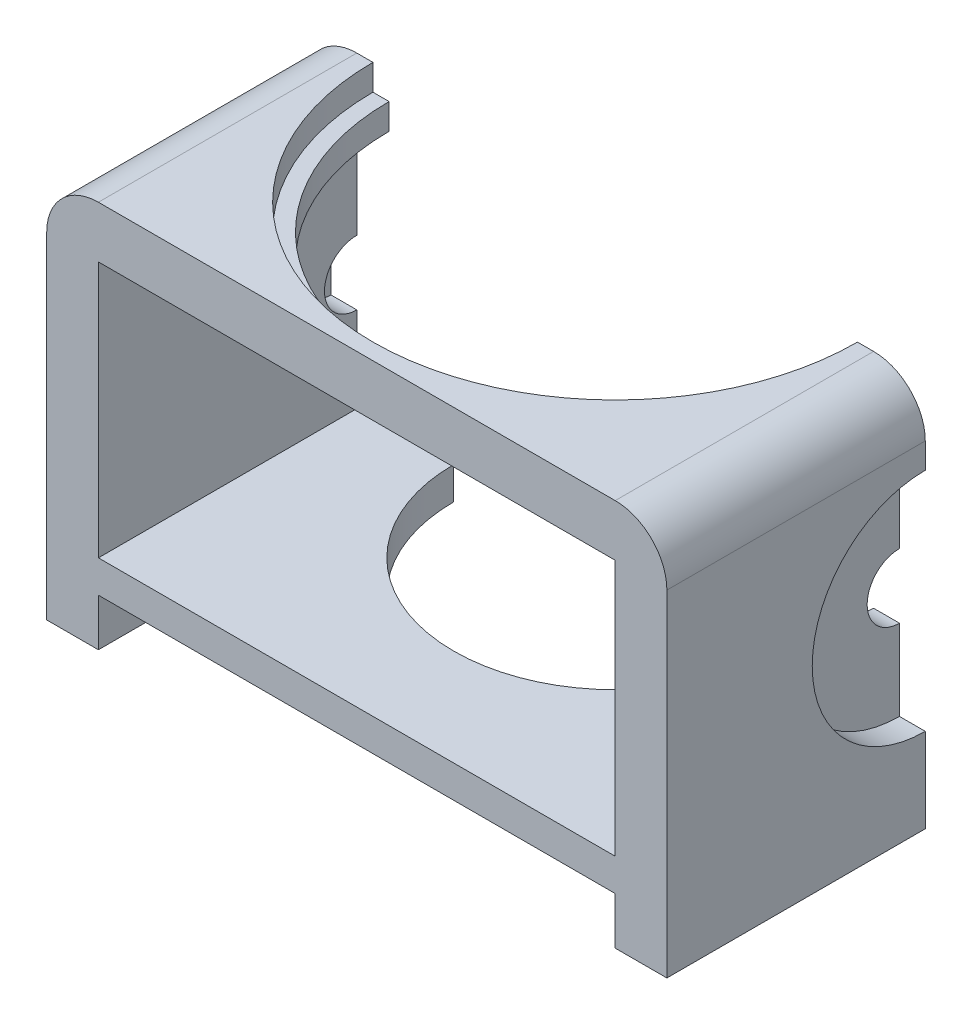
ISO-10303-21;
HEADER;
FILE_DESCRIPTION(('STEP AP214'),'2;1');
FILE_NAME('part.step','',(''),(''),'','','');
FILE_SCHEMA(('AUTOMOTIVE_DESIGN { 1 0 10303 214 1 1 1 1 }'));
ENDSEC;
DATA;
#1=APPLICATION_CONTEXT('core data for automotive mechanical design processes');
#2=APPLICATION_PROTOCOL_DEFINITION('international standard','automotive_design',2000,#1);
#3=PRODUCT_CONTEXT('',#1,'mechanical');
#4=PRODUCT('Part','Part','',(#3));
#5=PRODUCT_RELATED_PRODUCT_CATEGORY('part','',(#4));
#6=PRODUCT_DEFINITION_FORMATION('','',#4);
#7=PRODUCT_DEFINITION_CONTEXT('part definition',#1,'design');
#8=PRODUCT_DEFINITION('design','',#6,#7);
#9=PRODUCT_DEFINITION_SHAPE('','',#8);
#10=(LENGTH_UNIT() NAMED_UNIT(*) SI_UNIT(.MILLI.,.METRE.));
#11=(NAMED_UNIT(*) PLANE_ANGLE_UNIT() SI_UNIT($,.RADIAN.));
#12=(NAMED_UNIT(*) SI_UNIT($,.STERADIAN.) SOLID_ANGLE_UNIT());
#13=UNCERTAINTY_MEASURE_WITH_UNIT(LENGTH_MEASURE(1.E-05),#10,'distance_accuracy_value','');
#14=(GEOMETRIC_REPRESENTATION_CONTEXT(3) GLOBAL_UNCERTAINTY_ASSIGNED_CONTEXT((#13)) GLOBAL_UNIT_ASSIGNED_CONTEXT((#10,
#11,#12)) REPRESENTATION_CONTEXT('',''));
#15=CARTESIAN_POINT('',(0.,0.,0.));
#16=DIRECTION('',(0.,0.,1.));
#17=DIRECTION('',(1.,0.,0.));
#18=AXIS2_PLACEMENT_3D('',#15,#16,#17);
#19=CARTESIAN_POINT('',(-8.00000000000001,52.,80.));
#20=DIRECTION('',(0.,0.,1.));
#21=DIRECTION('',(1.,0.,0.));
#22=AXIS2_PLACEMENT_3D('',#19,#20,#21);
#23=PLANE('',#22);
#24=DIRECTION('',(1.,0.,0.));
#25=VECTOR('',#24,1.);
#26=CARTESIAN_POINT('',(-8.,0.,80.));
#27=LINE('',#26,#25);
#28=CARTESIAN_POINT('',(-8.,0.,80.));
#29=VERTEX_POINT('',#28);
#30=CARTESIAN_POINT('',(0.,0.,80.));
#31=VERTEX_POINT('',#30);
#32=EDGE_CURVE('E310',#29,#31,#27,.T.);
#33=ORIENTED_EDGE('',*,*,#32,.T.);
#34=DIRECTION('',(0.,1.,0.));
#35=VECTOR('',#34,1.);
#36=CARTESIAN_POINT('',(0.,0.,80.));
#37=LINE('',#36,#35);
#38=CARTESIAN_POINT('',(0.,52.,80.));
#39=VERTEX_POINT('',#38);
#40=EDGE_CURVE('E313',#31,#39,#37,.T.);
#41=ORIENTED_EDGE('',*,*,#40,.T.);
#42=CARTESIAN_POINT('',(-8.00000000000001,52.,80.));
#43=DIRECTION('',(0.,0.,1.));
#44=DIRECTION('',(1.,0.,0.));
#45=AXIS2_PLACEMENT_3D('',#42,#43,#44);
#46=CIRCLE('',#45,8.00000000000001);
#47=CARTESIAN_POINT('',(-8.00000000000001,60.,80.));
#48=VERTEX_POINT('',#47);
#49=EDGE_CURVE('E315',#39,#48,#46,.T.);
#50=ORIENTED_EDGE('',*,*,#49,.T.);
#51=DIRECTION('',(-1.,0.,0.));
#52=VECTOR('',#51,1.);
#53=CARTESIAN_POINT('',(-8.00000000000001,60.,80.));
#54=LINE('',#53,#52);
#55=CARTESIAN_POINT('',(-88.,60.,80.));
#56=VERTEX_POINT('',#55);
#57=EDGE_CURVE('E317',#48,#56,#54,.T.);
#58=ORIENTED_EDGE('',*,*,#57,.T.);
#59=CARTESIAN_POINT('',(-88.,52.,80.));
#60=DIRECTION('',(0.,0.,1.));
#61=DIRECTION('',(1.,0.,0.));
#62=AXIS2_PLACEMENT_3D('',#59,#60,#61);
#63=CIRCLE('',#62,8.);
#64=CARTESIAN_POINT('',(-96.,52.,80.));
#65=VERTEX_POINT('',#64);
#66=EDGE_CURVE('E319',#56,#65,#63,.T.);
#67=ORIENTED_EDGE('',*,*,#66,.T.);
#68=DIRECTION('',(0.,-1.,0.));
#69=VECTOR('',#68,1.);
#70=CARTESIAN_POINT('',(-96.,52.,80.));
#71=LINE('',#70,#69);
#72=CARTESIAN_POINT('',(-96.,0.,80.));
#73=VERTEX_POINT('',#72);
#74=EDGE_CURVE('E321',#65,#73,#71,.T.);
#75=ORIENTED_EDGE('',*,*,#74,.T.);
#76=DIRECTION('',(1.,0.,0.));
#77=VECTOR('',#76,1.);
#78=CARTESIAN_POINT('',(-96.,0.,80.));
#79=LINE('',#78,#77);
#80=CARTESIAN_POINT('',(-88.,0.,80.));
#81=VERTEX_POINT('',#80);
#82=EDGE_CURVE('E323',#73,#81,#79,.T.);
#83=ORIENTED_EDGE('',*,*,#82,.T.);
#84=DIRECTION('',(0.,1.,0.));
#85=VECTOR('',#84,1.);
#86=CARTESIAN_POINT('',(-88.,0.,80.));
#87=LINE('',#86,#85);
#88=CARTESIAN_POINT('',(-88.,7.32292899768644,80.));
#89=VERTEX_POINT('',#88);
#90=EDGE_CURVE('E325',#81,#89,#87,.T.);
#91=ORIENTED_EDGE('',*,*,#90,.T.);
#92=DIRECTION('',(1.,0.,0.));
#93=VECTOR('',#92,1.);
#94=CARTESIAN_POINT('',(-88.,7.32292899768644,80.));
#95=LINE('',#94,#93);
#96=CARTESIAN_POINT('',(-8.00000000000001,7.32292899768644,80.));
#97=VERTEX_POINT('',#96);
#98=EDGE_CURVE('E327',#89,#97,#95,.T.);
#99=ORIENTED_EDGE('',*,*,#98,.T.);
#100=DIRECTION('',(0.,-1.,0.));
#101=VECTOR('',#100,1.);
#102=CARTESIAN_POINT('',(-8.00000000000001,7.32292899768644,80.));
#103=LINE('',#102,#101);
#104=EDGE_CURVE('E329',#97,#29,#103,.T.);
#105=ORIENTED_EDGE('',*,*,#104,.T.);
#106=EDGE_LOOP('',(#33,#41,#50,#58,#67,#75,#83,#91,#99,#105));
#107=FACE_BOUND('',#106,.T.);
#108=DIRECTION('',(-1.,0.,0.));
#109=VECTOR('',#108,1.);
#110=CARTESIAN_POINT('',(-88.,52.,80.));
#111=LINE('',#110,#109);
#112=CARTESIAN_POINT('',(-8.00000000000001,52.,80.));
#113=VERTEX_POINT('',#112);
#114=CARTESIAN_POINT('',(-88.,52.,80.));
#115=VERTEX_POINT('',#114);
#116=EDGE_CURVE('E291',#113,#115,#111,.T.);
#117=ORIENTED_EDGE('',*,*,#116,.F.);
#118=DIRECTION('',(0.,1.,0.));
#119=VECTOR('',#118,1.);
#120=CARTESIAN_POINT('',(-8.00000000000001,52.,80.));
#121=LINE('',#120,#119);
#122=CARTESIAN_POINT('',(-8.,12.3229289976864,80.));
#123=VERTEX_POINT('',#122);
#124=EDGE_CURVE('E287',#123,#113,#121,.T.);
#125=ORIENTED_EDGE('',*,*,#124,.F.);
#126=DIRECTION('',(1.,0.,0.));
#127=VECTOR('',#126,1.);
#128=CARTESIAN_POINT('',(-8.,12.3229289976864,80.));
#129=LINE('',#128,#127);
#130=CARTESIAN_POINT('',(-88.,12.3229289976864,80.));
#131=VERTEX_POINT('',#130);
#132=EDGE_CURVE('E296',#131,#123,#129,.T.);
#133=ORIENTED_EDGE('',*,*,#132,.F.);
#134=DIRECTION('',(0.,-1.,0.));
#135=VECTOR('',#134,1.);
#136=CARTESIAN_POINT('',(-88.,12.3229289976864,80.));
#137=LINE('',#136,#135);
#138=EDGE_CURVE('E293',#115,#131,#137,.T.);
#139=ORIENTED_EDGE('',*,*,#138,.F.);
#140=EDGE_LOOP('',(#117,#125,#133,#139));
#141=FACE_BOUND('',#140,.T.);
#142=ADVANCED_FACE('F34',(#107,#141),#23,.T.);
#143=CARTESIAN_POINT('',(-7.99999999999999,0.,55.));
#144=DIRECTION('',(0.,0.,1.));
#145=DIRECTION('',(1.,0.,0.));
#146=AXIS2_PLACEMENT_3D('',#143,#144,#145);
#147=PLANE('',#146);
#148=DIRECTION('',(0.,1.,0.));
#149=VECTOR('',#148,1.);
#150=CARTESIAN_POINT('',(-20.,0.,55.));
#151=LINE('',#150,#149);
#152=CARTESIAN_POINT('',(-20.,7.32292899768644,55.));
#153=VERTEX_POINT('',#152);
#154=CARTESIAN_POINT('',(-20.,12.3229289976864,55.));
#155=VERTEX_POINT('',#154);
#156=EDGE_CURVE('E261',#153,#155,#151,.T.);
#157=ORIENTED_EDGE('',*,*,#156,.T.);
#158=DIRECTION('',(1.,0.,0.));
#159=VECTOR('',#158,1.);
#160=CARTESIAN_POINT('',(-8.,12.3229289976864,55.));
#161=LINE('',#160,#159);
#162=CARTESIAN_POINT('',(-8.,12.3229289976864,55.));
#163=VERTEX_POINT('',#162);
#164=EDGE_CURVE('E258',#155,#163,#161,.T.);
#165=ORIENTED_EDGE('',*,*,#164,.T.);
#166=DIRECTION('',(0.,1.,0.));
#167=VECTOR('',#166,1.);
#168=CARTESIAN_POINT('',(-7.99999999999999,0.,55.));
#169=LINE('',#168,#167);
#170=CARTESIAN_POINT('',(-8.,7.32292899768644,55.));
#171=VERTEX_POINT('',#170);
#172=EDGE_CURVE('E262',#171,#163,#169,.T.);
#173=ORIENTED_EDGE('',*,*,#172,.F.);
#174=DIRECTION('',(1.,0.,0.));
#175=VECTOR('',#174,1.);
#176=CARTESIAN_POINT('',(-88.,7.32292899768644,55.));
#177=LINE('',#176,#175);
#178=EDGE_CURVE('E268',#153,#171,#177,.T.);
#179=ORIENTED_EDGE('',*,*,#178,.F.);
#180=EDGE_LOOP('',(#157,#165,#173,#179));
#181=FACE_BOUND('',#180,.T.);
#182=ADVANCED_FACE('F483',(#181),#147,.F.);
#183=CARTESIAN_POINT('',(-48.,52.,40.));
#184=DIRECTION('',(0.,1.,0.));
#185=DIRECTION('',(-1.,0.,0.));
#186=AXIS2_PLACEMENT_3D('',#183,#184,#185);
#187=CYLINDRICAL_SURFACE('',#186,35.);
#188=CARTESIAN_POINT('',(-48.,56.,40.));
#189=DIRECTION('',(0.,1.,0.));
#190=DIRECTION('',(-1.,0.,0.));
#191=AXIS2_PLACEMENT_3D('',#188,#189,#190);
#192=CIRCLE('',#191,35.);
#193=CARTESIAN_POINT('',(-83.,56.,40.));
#194=VERTEX_POINT('',#193);
#195=CARTESIAN_POINT('',(-13.,56.,40.));
#196=VERTEX_POINT('',#195);
#197=EDGE_CURVE('E277',#194,#196,#192,.T.);
#198=ORIENTED_EDGE('',*,*,#197,.T.);
#199=DIRECTION('',(0.,1.,0.));
#200=VECTOR('',#199,1.);
#201=CARTESIAN_POINT('',(-13.,52.,40.));
#202=LINE('',#201,#200);
#203=CARTESIAN_POINT('',(-13.,52.,40.));
#204=VERTEX_POINT('',#203);
#205=EDGE_CURVE('E451',#196,#204,#202,.F.);
#206=ORIENTED_EDGE('',*,*,#205,.T.);
#207=CARTESIAN_POINT('',(-48.,52.,40.));
#208=DIRECTION('',(0.,1.,0.));
#209=DIRECTION('',(-1.,0.,0.));
#210=AXIS2_PLACEMENT_3D('',#207,#208,#209);
#211=CIRCLE('',#210,35.);
#212=CARTESIAN_POINT('',(-83.,52.,40.));
#213=VERTEX_POINT('',#212);
#214=EDGE_CURVE('E278',#213,#204,#211,.T.);
#215=ORIENTED_EDGE('',*,*,#214,.F.);
#216=DIRECTION('',(0.,1.,0.));
#217=VECTOR('',#216,1.);
#218=CARTESIAN_POINT('',(-83.,52.,40.));
#219=LINE('',#218,#217);
#220=EDGE_CURVE('E382',#213,#194,#219,.T.);
#221=ORIENTED_EDGE('',*,*,#220,.T.);
#222=EDGE_LOOP('',(#198,#206,#215,#221));
#223=FACE_BOUND('',#222,.T.);
#224=ADVANCED_FACE('F550',(#223),#187,.F.);
#225=CARTESIAN_POINT('',(-48.,56.,40.));
#226=DIRECTION('',(0.,1.,0.));
#227=DIRECTION('',(-1.,0.,0.));
#228=AXIS2_PLACEMENT_3D('',#225,#226,#227);
#229=PLANE('',#228);
#230=DIRECTION('',(1.,0.,0.));
#231=VECTOR('',#230,1.);
#232=CARTESIAN_POINT('',(-48.,56.,40.));
#233=LINE('',#232,#231);
#234=CARTESIAN_POINT('',(-85.5,56.,40.));
#235=VERTEX_POINT('',#234);
#236=EDGE_CURVE('E385',#235,#194,#233,.T.);
#237=ORIENTED_EDGE('',*,*,#236,.F.);
#238=CARTESIAN_POINT('',(-48.,56.,40.));
#239=DIRECTION('',(0.,1.,0.));
#240=DIRECTION('',(-1.,0.,0.));
#241=AXIS2_PLACEMENT_3D('',#238,#239,#240);
#242=CIRCLE('',#241,37.5);
#243=CARTESIAN_POINT('',(-10.5,56.,40.));
#244=VERTEX_POINT('',#243);
#245=EDGE_CURVE('E284',#235,#244,#242,.T.);
#246=ORIENTED_EDGE('',*,*,#245,.T.);
#247=EDGE_CURVE('E454',#196,#244,#233,.T.);
#248=ORIENTED_EDGE('',*,*,#247,.F.);
#249=ORIENTED_EDGE('',*,*,#197,.F.);
#250=EDGE_LOOP('',(#237,#246,#248,#249));
#251=FACE_BOUND('',#250,.T.);
#252=ADVANCED_FACE('F587',(#251),#229,.T.);
#253=CARTESIAN_POINT('',(-48.,56.,40.));
#254=DIRECTION('',(0.,1.,0.));
#255=DIRECTION('',(-1.,0.,0.));
#256=AXIS2_PLACEMENT_3D('',#253,#254,#255);
#257=CYLINDRICAL_SURFACE('',#256,37.5);
#258=CARTESIAN_POINT('',(-48.,60.,40.));
#259=DIRECTION('',(0.,1.,0.));
#260=DIRECTION('',(-1.,0.,0.));
#261=AXIS2_PLACEMENT_3D('',#258,#259,#260);
#262=CIRCLE('',#261,37.5);
#263=CARTESIAN_POINT('',(-85.5,60.,40.));
#264=VERTEX_POINT('',#263);
#265=CARTESIAN_POINT('',(-10.5,60.,40.));
#266=VERTEX_POINT('',#265);
#267=EDGE_CURVE('E281',#264,#266,#262,.T.);
#268=ORIENTED_EDGE('',*,*,#267,.T.);
#269=DIRECTION('',(0.,1.,0.));
#270=VECTOR('',#269,1.);
#271=CARTESIAN_POINT('',(-10.5,56.,40.));
#272=LINE('',#271,#270);
#273=EDGE_CURVE('E509',#266,#244,#272,.F.);
#274=ORIENTED_EDGE('',*,*,#273,.T.);
#275=ORIENTED_EDGE('',*,*,#245,.F.);
#276=DIRECTION('',(0.,1.,0.));
#277=VECTOR('',#276,1.);
#278=CARTESIAN_POINT('',(-85.5,56.,40.));
#279=LINE('',#278,#277);
#280=EDGE_CURVE('E386',#235,#264,#279,.T.);
#281=ORIENTED_EDGE('',*,*,#280,.T.);
#282=EDGE_LOOP('',(#268,#274,#275,#281));
#283=FACE_BOUND('',#282,.T.);
#284=ADVANCED_FACE('F536',(#283),#257,.F.);
#285=CARTESIAN_POINT('',(-110.142135623731,30.57,40.));
#286=DIRECTION('',(1.,0.,0.));
#287=DIRECTION('',(0.,0.,-1.));
#288=AXIS2_PLACEMENT_3D('',#285,#286,#287);
#289=CYLINDRICAL_SURFACE('',#288,5.);
#290=CARTESIAN_POINT('',(-88.,30.57,40.));
#291=DIRECTION('',(1.,0.,0.));
#292=DIRECTION('',(0.,0.,-1.));
#293=AXIS2_PLACEMENT_3D('',#290,#291,#292);
#294=CIRCLE('',#293,5.);
#295=CARTESIAN_POINT('',(-88.,35.57,40.));
#296=VERTEX_POINT('',#295);
#297=CARTESIAN_POINT('',(-88.,25.57,40.));
#298=VERTEX_POINT('',#297);
#299=EDGE_CURVE('E256',#296,#298,#294,.T.);
#300=ORIENTED_EDGE('',*,*,#299,.T.);
#301=DIRECTION('',(1.,0.,0.));
#302=VECTOR('',#301,1.);
#303=CARTESIAN_POINT('',(-110.142135623731,25.57,40.));
#304=LINE('',#303,#302);
#305=CARTESIAN_POINT('',(-92.,25.57,40.));
#306=VERTEX_POINT('',#305);
#307=EDGE_CURVE('E368',#298,#306,#304,.F.);
#308=ORIENTED_EDGE('',*,*,#307,.T.);
#309=CARTESIAN_POINT('',(-92.,30.57,40.));
#310=DIRECTION('',(1.,0.,0.));
#311=DIRECTION('',(0.,1.,0.));
#312=AXIS2_PLACEMENT_3D('',#309,#310,#311);
#313=CIRCLE('',#312,5.);
#314=CARTESIAN_POINT('',(-92.,35.57,40.));
#315=VERTEX_POINT('',#314);
#316=EDGE_CURVE('E38',#306,#315,#313,.F.);
#317=ORIENTED_EDGE('',*,*,#316,.T.);
#318=DIRECTION('',(1.,0.,0.));
#319=VECTOR('',#318,1.);
#320=CARTESIAN_POINT('',(-110.142135623731,35.57,40.));
#321=LINE('',#320,#319);
#322=EDGE_CURVE('E367',#315,#296,#321,.T.);
#323=ORIENTED_EDGE('',*,*,#322,.T.);
#324=EDGE_LOOP('',(#300,#308,#317,#323));
#325=FACE_BOUND('',#324,.T.);
#326=ADVANCED_FACE('F366',(#325),#289,.F.);
#327=CARTESIAN_POINT('',(-92.,52.,80.));
#328=DIRECTION('',(1.,0.,0.));
#329=DIRECTION('',(0.,1.,0.));
#330=AXIS2_PLACEMENT_3D('',#327,#328,#329);
#331=PLANE('',#330);
#332=DIRECTION('',(0.,-1.,0.));
#333=VECTOR('',#332,1.);
#334=CARTESIAN_POINT('',(-92.,52.,40.));
#335=LINE('',#334,#333);
#336=EDGE_CURVE('E372',#315,#306,#335,.T.);
#337=ORIENTED_EDGE('',*,*,#336,.F.);
#338=ORIENTED_EDGE('',*,*,#316,.F.);
#339=EDGE_LOOP('',(#337,#338));
#340=FACE_BOUND('',#339,.T.);
#341=ADVANCED_FACE('F371',(#340),#331,.T.);
#342=CARTESIAN_POINT('',(-48.,0.,40.));
#343=DIRECTION('',(0.,1.,0.));
#344=DIRECTION('',(-1.,0.,0.));
#345=AXIS2_PLACEMENT_3D('',#342,#343,#344);
#346=CYLINDRICAL_SURFACE('',#345,25.);
#347=CARTESIAN_POINT('',(-48.,12.3229289976864,40.));
#348=DIRECTION('',(0.,1.,0.));
#349=DIRECTION('',(-1.,0.,0.));
#350=AXIS2_PLACEMENT_3D('',#347,#348,#349);
#351=CIRCLE('',#350,25.);
#352=CARTESIAN_POINT('',(-73.,12.3229289976864,40.));
#353=VERTEX_POINT('',#352);
#354=CARTESIAN_POINT('',(-23.,12.3229289976864,40.));
#355=VERTEX_POINT('',#354);
#356=EDGE_CURVE('E271',#353,#355,#351,.T.);
#357=ORIENTED_EDGE('',*,*,#356,.T.);
#358=DIRECTION('',(0.,1.,0.));
#359=VECTOR('',#358,1.);
#360=CARTESIAN_POINT('',(-23.,0.,40.));
#361=LINE('',#360,#359);
#362=CARTESIAN_POINT('',(-23.,7.32292899768644,40.));
#363=VERTEX_POINT('',#362);
#364=EDGE_CURVE('E246',#355,#363,#361,.F.);
#365=ORIENTED_EDGE('',*,*,#364,.T.);
#366=CARTESIAN_POINT('',(-48.,7.32292899768644,40.));
#367=DIRECTION('',(0.,1.,0.));
#368=DIRECTION('',(0.,0.,1.));
#369=AXIS2_PLACEMENT_3D('',#366,#367,#368);
#370=CIRCLE('',#369,25.);
#371=CARTESIAN_POINT('',(-73.,7.32292899768644,40.));
#372=VERTEX_POINT('',#371);
#373=EDGE_CURVE('E274',#372,#363,#370,.T.);
#374=ORIENTED_EDGE('',*,*,#373,.F.);
#375=DIRECTION('',(0.,1.,0.));
#376=VECTOR('',#375,1.);
#377=CARTESIAN_POINT('',(-73.,0.,40.));
#378=LINE('',#377,#376);
#379=EDGE_CURVE('E395',#372,#353,#378,.T.);
#380=ORIENTED_EDGE('',*,*,#379,.T.);
#381=EDGE_LOOP('',(#357,#365,#374,#380));
#382=FACE_BOUND('',#381,.T.);
#383=ADVANCED_FACE('F419',(#382),#346,.F.);
#384=CARTESIAN_POINT('',(-20.,0.,25.));
#385=DIRECTION('',(-1.,0.,0.));
#386=DIRECTION('',(0.,-1.,0.));
#387=AXIS2_PLACEMENT_3D('',#384,#385,#386);
#388=PLANE('',#387);
#389=DIRECTION('',(0.,0.,1.));
#390=VECTOR('',#389,1.);
#391=CARTESIAN_POINT('',(-20.,7.32292899768644,80.));
#392=LINE('',#391,#390);
#393=CARTESIAN_POINT('',(-20.,7.32292899768644,40.));
#394=VERTEX_POINT('',#393);
#395=EDGE_CURVE('E264',#394,#153,#392,.T.);
#396=ORIENTED_EDGE('',*,*,#395,.F.);
#397=DIRECTION('',(0.,1.,0.));
#398=VECTOR('',#397,1.);
#399=CARTESIAN_POINT('',(-20.,0.,40.));
#400=LINE('',#399,#398);
#401=CARTESIAN_POINT('',(-20.,12.3229289976864,40.));
#402=VERTEX_POINT('',#401);
#403=EDGE_CURVE('E410',#394,#402,#400,.T.);
#404=ORIENTED_EDGE('',*,*,#403,.T.);
#405=DIRECTION('',(0.,0.,1.));
#406=VECTOR('',#405,1.);
#407=CARTESIAN_POINT('',(-20.,12.3229289976864,25.));
#408=LINE('',#407,#406);
#409=EDGE_CURVE('E255',#402,#155,#408,.T.);
#410=ORIENTED_EDGE('',*,*,#409,.T.);
#411=ORIENTED_EDGE('',*,*,#156,.F.);
#412=EDGE_LOOP('',(#396,#404,#410,#411));
#413=FACE_BOUND('',#412,.T.);
#414=ADVANCED_FACE('F480',(#413),#388,.F.);
#415=CARTESIAN_POINT('',(-8.,12.3229289976864,80.));
#416=DIRECTION('',(0.,1.,0.));
#417=DIRECTION('',(-1.,0.,0.));
#418=AXIS2_PLACEMENT_3D('',#415,#416,#417);
#419=PLANE('',#418);
#420=DIRECTION('',(1.,0.,0.));
#421=VECTOR('',#420,1.);
#422=CARTESIAN_POINT('',(-8.,12.3229289976864,40.));
#423=LINE('',#422,#421);
#424=CARTESIAN_POINT('',(-88.,12.3229289976864,40.));
#425=VERTEX_POINT('',#424);
#426=EDGE_CURVE('E389',#425,#353,#423,.T.);
#427=ORIENTED_EDGE('',*,*,#426,.F.);
#428=DIRECTION('',(0.,0.,-1.));
#429=VECTOR('',#428,1.);
#430=CARTESIAN_POINT('',(-88.,12.3229289976864,80.));
#431=LINE('',#430,#429);
#432=EDGE_CURVE('E301',#131,#425,#431,.T.);
#433=ORIENTED_EDGE('',*,*,#432,.F.);
#434=ORIENTED_EDGE('',*,*,#132,.T.);
#435=DIRECTION('',(0.,0.,-1.));
#436=VECTOR('',#435,1.);
#437=CARTESIAN_POINT('',(-8.,12.3229289976864,80.));
#438=LINE('',#437,#436);
#439=EDGE_CURVE('E298',#123,#163,#438,.T.);
#440=ORIENTED_EDGE('',*,*,#439,.T.);
#441=ORIENTED_EDGE('',*,*,#164,.F.);
#442=ORIENTED_EDGE('',*,*,#409,.F.);
#443=EDGE_CURVE('E51',#355,#402,#423,.T.);
#444=ORIENTED_EDGE('',*,*,#443,.F.);
#445=ORIENTED_EDGE('',*,*,#356,.F.);
#446=EDGE_LOOP('',(#427,#433,#434,#440,#441,#442,#444,#445));
#447=FACE_BOUND('',#446,.T.);
#448=ADVANCED_FACE('F476',(#447),#419,.T.);
#449=CARTESIAN_POINT('',(-88.,12.3229289976864,80.));
#450=DIRECTION('',(1.,0.,0.));
#451=DIRECTION('',(0.,0.,-1.));
#452=AXIS2_PLACEMENT_3D('',#449,#450,#451);
#453=PLANE('',#452);
#454=DIRECTION('',(0.,-1.,0.));
#455=VECTOR('',#454,1.);
#456=CARTESIAN_POINT('',(-88.,12.3229289976864,40.));
#457=LINE('',#456,#455);
#458=CARTESIAN_POINT('',(-88.,52.,40.));
#459=VERTEX_POINT('',#458);
#460=EDGE_CURVE('E59',#459,#296,#457,.T.);
#461=ORIENTED_EDGE('',*,*,#460,.F.);
#462=DIRECTION('',(0.,0.,-1.));
#463=VECTOR('',#462,1.);
#464=CARTESIAN_POINT('',(-88.,52.,80.));
#465=LINE('',#464,#463);
#466=EDGE_CURVE('E304',#115,#459,#465,.T.);
#467=ORIENTED_EDGE('',*,*,#466,.F.);
#468=ORIENTED_EDGE('',*,*,#138,.T.);
#469=ORIENTED_EDGE('',*,*,#432,.T.);
#470=EDGE_CURVE('E376',#298,#425,#457,.T.);
#471=ORIENTED_EDGE('',*,*,#470,.F.);
#472=ORIENTED_EDGE('',*,*,#299,.F.);
#473=EDGE_LOOP('',(#461,#467,#468,#469,#471,#472));
#474=FACE_BOUND('',#473,.T.);
#475=ADVANCED_FACE('F465',(#474),#453,.T.);
#476=CARTESIAN_POINT('',(-88.,52.,80.));
#477=DIRECTION('',(0.,-1.,0.));
#478=DIRECTION('',(0.,0.,-1.));
#479=AXIS2_PLACEMENT_3D('',#476,#477,#478);
#480=PLANE('',#479);
#481=DIRECTION('',(-1.,0.,0.));
#482=VECTOR('',#481,1.);
#483=CARTESIAN_POINT('',(-88.,52.,40.));
#484=LINE('',#483,#482);
#485=CARTESIAN_POINT('',(-8.00000000000005,52.,40.));
#486=VERTEX_POINT('',#485);
#487=EDGE_CURVE('E452',#486,#204,#484,.T.);
#488=ORIENTED_EDGE('',*,*,#487,.F.);
#489=DIRECTION('',(0.,0.,-1.));
#490=VECTOR('',#489,1.);
#491=CARTESIAN_POINT('',(-8.00000000000001,52.,80.));
#492=LINE('',#491,#490);
#493=EDGE_CURVE('E307',#113,#486,#492,.T.);
#494=ORIENTED_EDGE('',*,*,#493,.F.);
#495=ORIENTED_EDGE('',*,*,#116,.T.);
#496=ORIENTED_EDGE('',*,*,#466,.T.);
#497=EDGE_CURVE('E374',#213,#459,#484,.T.);
#498=ORIENTED_EDGE('',*,*,#497,.F.);
#499=ORIENTED_EDGE('',*,*,#214,.T.);
#500=EDGE_LOOP('',(#488,#494,#495,#496,#498,#499));
#501=FACE_BOUND('',#500,.T.);
#502=ADVANCED_FACE('F468',(#501),#480,.T.);
#503=CARTESIAN_POINT('',(-8.00000000000001,7.32292899768644,80.));
#504=DIRECTION('',(1.,0.,0.));
#505=DIRECTION('',(0.,1.,0.));
#506=AXIS2_PLACEMENT_3D('',#503,#504,#505);
#507=PLANE('',#506);
#508=ORIENTED_EDGE('',*,*,#493,.T.);
#509=DIRECTION('',(0.,-1.,0.));
#510=VECTOR('',#509,1.);
#511=CARTESIAN_POINT('',(-8.00000000000001,7.32292899768644,40.));
#512=LINE('',#511,#510);
#513=CARTESIAN_POINT('',(-8.00000000000004,35.57,40.));
#514=VERTEX_POINT('',#513);
#515=EDGE_CURVE('E458',#486,#514,#512,.T.);
#516=ORIENTED_EDGE('',*,*,#515,.T.);
#517=CARTESIAN_POINT('',(-8.00000000000004,30.57,40.));
#518=DIRECTION('',(1.,0.,0.));
#519=DIRECTION('',(0.,1.,0.));
#520=AXIS2_PLACEMENT_3D('',#517,#518,#519);
#521=CIRCLE('',#520,5.);
#522=CARTESIAN_POINT('',(-8.00000000000004,25.57,40.));
#523=VERTEX_POINT('',#522);
#524=EDGE_CURVE('E252',#514,#523,#521,.T.);
#525=ORIENTED_EDGE('',*,*,#524,.T.);
#526=CARTESIAN_POINT('',(-8.,0.,40.));
#527=VERTEX_POINT('',#526);
#528=EDGE_CURVE('E377',#523,#527,#512,.T.);
#529=ORIENTED_EDGE('',*,*,#528,.T.);
#530=DIRECTION('',(0.,0.,-1.));
#531=VECTOR('',#530,1.);
#532=CARTESIAN_POINT('',(-8.,0.,80.));
#533=LINE('',#532,#531);
#534=EDGE_CURVE('E331',#29,#527,#533,.T.);
#535=ORIENTED_EDGE('',*,*,#534,.F.);
#536=ORIENTED_EDGE('',*,*,#104,.F.);
#537=DIRECTION('',(0.,0.,-1.));
#538=VECTOR('',#537,1.);
#539=CARTESIAN_POINT('',(-8.00000000000001,7.32292899768644,80.));
#540=LINE('',#539,#538);
#541=EDGE_CURVE('E334',#97,#171,#540,.T.);
#542=ORIENTED_EDGE('',*,*,#541,.T.);
#543=ORIENTED_EDGE('',*,*,#172,.T.);
#544=ORIENTED_EDGE('',*,*,#439,.F.);
#545=ORIENTED_EDGE('',*,*,#124,.T.);
#546=EDGE_LOOP('',(#508,#516,#525,#529,#535,#536,#542,#543,#544,#545));
#547=FACE_BOUND('',#546,.T.);
#548=ADVANCED_FACE('F487',(#547),#507,.F.);
#549=CARTESIAN_POINT('',(-88.,7.32292899768644,80.));
#550=DIRECTION('',(0.,1.,0.));
#551=DIRECTION('',(0.,0.,1.));
#552=AXIS2_PLACEMENT_3D('',#549,#550,#551);
#553=PLANE('',#552);
#554=DIRECTION('',(0.,0.,-1.));
#555=VECTOR('',#554,1.);
#556=CARTESIAN_POINT('',(-88.,7.32292899768644,80.));
#557=LINE('',#556,#555);
#558=CARTESIAN_POINT('',(-88.,7.32292899768644,40.));
#559=VERTEX_POINT('',#558);
#560=EDGE_CURVE('E337',#89,#559,#557,.T.);
#561=ORIENTED_EDGE('',*,*,#560,.T.);
#562=DIRECTION('',(1.,0.,0.));
#563=VECTOR('',#562,1.);
#564=CARTESIAN_POINT('',(-88.,7.32292899768644,40.));
#565=LINE('',#564,#563);
#566=EDGE_CURVE('E398',#559,#372,#565,.T.);
#567=ORIENTED_EDGE('',*,*,#566,.T.);
#568=ORIENTED_EDGE('',*,*,#373,.T.);
#569=EDGE_CURVE('E402',#363,#394,#565,.T.);
#570=ORIENTED_EDGE('',*,*,#569,.T.);
#571=ORIENTED_EDGE('',*,*,#395,.T.);
#572=ORIENTED_EDGE('',*,*,#178,.T.);
#573=ORIENTED_EDGE('',*,*,#541,.F.);
#574=ORIENTED_EDGE('',*,*,#98,.F.);
#575=EDGE_LOOP('',(#561,#567,#568,#570,#571,#572,#573,#574));
#576=FACE_BOUND('',#575,.T.);
#577=ADVANCED_FACE('F421',(#576),#553,.F.);
#578=CARTESIAN_POINT('',(-88.,0.,80.));
#579=DIRECTION('',(-1.,0.,0.));
#580=DIRECTION('',(0.,0.,1.));
#581=AXIS2_PLACEMENT_3D('',#578,#579,#580);
#582=PLANE('',#581);
#583=DIRECTION('',(0.,0.,-1.));
#584=VECTOR('',#583,1.);
#585=CARTESIAN_POINT('',(-88.,0.,80.));
#586=LINE('',#585,#584);
#587=CARTESIAN_POINT('',(-88.,0.,40.));
#588=VERTEX_POINT('',#587);
#589=EDGE_CURVE('E340',#81,#588,#586,.T.);
#590=ORIENTED_EDGE('',*,*,#589,.T.);
#591=DIRECTION('',(0.,1.,0.));
#592=VECTOR('',#591,1.);
#593=CARTESIAN_POINT('',(-88.,0.,40.));
#594=LINE('',#593,#592);
#595=EDGE_CURVE('E401',#588,#559,#594,.T.);
#596=ORIENTED_EDGE('',*,*,#595,.T.);
#597=ORIENTED_EDGE('',*,*,#560,.F.);
#598=ORIENTED_EDGE('',*,*,#90,.F.);
#599=EDGE_LOOP('',(#590,#596,#597,#598));
#600=FACE_BOUND('',#599,.T.);
#601=ADVANCED_FACE('F426',(#600),#582,.F.);
#602=CARTESIAN_POINT('',(-96.,0.,80.));
#603=DIRECTION('',(0.,1.,0.));
#604=DIRECTION('',(0.,0.,1.));
#605=AXIS2_PLACEMENT_3D('',#602,#603,#604);
#606=PLANE('',#605);
#607=DIRECTION('',(0.,0.,-1.));
#608=VECTOR('',#607,1.);
#609=CARTESIAN_POINT('',(-96.,0.,80.));
#610=LINE('',#609,#608);
#611=CARTESIAN_POINT('',(-96.,0.,40.));
#612=VERTEX_POINT('',#611);
#613=EDGE_CURVE('E343',#73,#612,#610,.T.);
#614=ORIENTED_EDGE('',*,*,#613,.T.);
#615=DIRECTION('',(1.,0.,0.));
#616=VECTOR('',#615,1.);
#617=CARTESIAN_POINT('',(-96.,0.,40.));
#618=LINE('',#617,#616);
#619=EDGE_CURVE('E405',#612,#588,#618,.T.);
#620=ORIENTED_EDGE('',*,*,#619,.T.);
#621=ORIENTED_EDGE('',*,*,#589,.F.);
#622=ORIENTED_EDGE('',*,*,#82,.F.);
#623=EDGE_LOOP('',(#614,#620,#621,#622));
#624=FACE_BOUND('',#623,.T.);
#625=ADVANCED_FACE('F431',(#624),#606,.F.);
#626=CARTESIAN_POINT('',(-96.,52.,80.));
#627=DIRECTION('',(1.,0.,0.));
#628=DIRECTION('',(0.,1.,0.));
#629=AXIS2_PLACEMENT_3D('',#626,#627,#628);
#630=PLANE('',#629);
#631=DIRECTION('',(0.,0.,-1.));
#632=VECTOR('',#631,1.);
#633=CARTESIAN_POINT('',(-96.,52.,80.));
#634=LINE('',#633,#632);
#635=CARTESIAN_POINT('',(-96.,52.,40.));
#636=VERTEX_POINT('',#635);
#637=EDGE_CURVE('E346',#65,#636,#634,.T.);
#638=ORIENTED_EDGE('',*,*,#637,.T.);
#639=DIRECTION('',(0.,-1.,0.));
#640=VECTOR('',#639,1.);
#641=CARTESIAN_POINT('',(-96.,52.,40.));
#642=LINE('',#641,#640);
#643=EDGE_CURVE('E408',#636,#612,#642,.T.);
#644=ORIENTED_EDGE('',*,*,#643,.T.);
#645=ORIENTED_EDGE('',*,*,#613,.F.);
#646=ORIENTED_EDGE('',*,*,#74,.F.);
#647=EDGE_LOOP('',(#638,#644,#645,#646));
#648=FACE_BOUND('',#647,.T.);
#649=ADVANCED_FACE('F434',(#648),#630,.F.);
#650=CARTESIAN_POINT('',(-88.,52.,80.));
#651=DIRECTION('',(0.,0.,-1.));
#652=DIRECTION('',(-1.,0.,0.));
#653=AXIS2_PLACEMENT_3D('',#650,#651,#652);
#654=CYLINDRICAL_SURFACE('',#653,8.);
#655=DIRECTION('',(0.,0.,-1.));
#656=VECTOR('',#655,1.);
#657=CARTESIAN_POINT('',(-88.,60.,80.));
#658=LINE('',#657,#656);
#659=CARTESIAN_POINT('',(-88.,60.,40.));
#660=VERTEX_POINT('',#659);
#661=EDGE_CURVE('E349',#56,#660,#658,.T.);
#662=ORIENTED_EDGE('',*,*,#661,.T.);
#663=CARTESIAN_POINT('',(-88.,52.,40.));
#664=DIRECTION('',(0.,0.,1.));
#665=DIRECTION('',(1.,0.,0.));
#666=AXIS2_PLACEMENT_3D('',#663,#664,#665);
#667=CIRCLE('',#666,8.);
#668=EDGE_CURVE('E391',#660,#636,#667,.T.);
#669=ORIENTED_EDGE('',*,*,#668,.T.);
#670=ORIENTED_EDGE('',*,*,#637,.F.);
#671=ORIENTED_EDGE('',*,*,#66,.F.);
#672=EDGE_LOOP('',(#662,#669,#670,#671));
#673=FACE_BOUND('',#672,.T.);
#674=ADVANCED_FACE('F439',(#673),#654,.T.);
#675=CARTESIAN_POINT('',(-8.00000000000001,60.,80.));
#676=DIRECTION('',(0.,-1.,0.));
#677=DIRECTION('',(1.,0.,0.));
#678=AXIS2_PLACEMENT_3D('',#675,#676,#677);
#679=PLANE('',#678);
#680=DIRECTION('',(0.,0.,-1.));
#681=VECTOR('',#680,1.);
#682=CARTESIAN_POINT('',(-8.00000000000001,60.,80.));
#683=LINE('',#682,#681);
#684=CARTESIAN_POINT('',(-8.00000000000001,60.,40.));
#685=VERTEX_POINT('',#684);
#686=EDGE_CURVE('E352',#48,#685,#683,.T.);
#687=ORIENTED_EDGE('',*,*,#686,.T.);
#688=DIRECTION('',(-1.,0.,0.));
#689=VECTOR('',#688,1.);
#690=CARTESIAN_POINT('',(-8.00000000000001,60.,40.));
#691=LINE('',#690,#689);
#692=EDGE_CURVE('E448',#685,#266,#691,.T.);
#693=ORIENTED_EDGE('',*,*,#692,.T.);
#694=ORIENTED_EDGE('',*,*,#267,.F.);
#695=EDGE_CURVE('E392',#264,#660,#691,.T.);
#696=ORIENTED_EDGE('',*,*,#695,.T.);
#697=ORIENTED_EDGE('',*,*,#661,.F.);
#698=ORIENTED_EDGE('',*,*,#57,.F.);
#699=EDGE_LOOP('',(#687,#693,#694,#696,#697,#698));
#700=FACE_BOUND('',#699,.T.);
#701=ADVANCED_FACE('F444',(#700),#679,.F.);
#702=CARTESIAN_POINT('',(-8.00000000000001,52.,80.));
#703=DIRECTION('',(0.,0.,-1.));
#704=DIRECTION('',(-1.,0.,0.));
#705=AXIS2_PLACEMENT_3D('',#702,#703,#704);
#706=CYLINDRICAL_SURFACE('',#705,8.00000000000001);
#707=DIRECTION('',(0.,0.,-1.));
#708=VECTOR('',#707,1.);
#709=CARTESIAN_POINT('',(0.,52.,80.));
#710=LINE('',#709,#708);
#711=CARTESIAN_POINT('',(0.,52.,40.));
#712=VERTEX_POINT('',#711);
#713=EDGE_CURVE('E355',#39,#712,#710,.T.);
#714=ORIENTED_EDGE('',*,*,#713,.T.);
#715=CARTESIAN_POINT('',(-8.00000000000001,52.,40.));
#716=DIRECTION('',(0.,0.,1.));
#717=DIRECTION('',(1.,0.,0.));
#718=AXIS2_PLACEMENT_3D('',#715,#716,#717);
#719=CIRCLE('',#718,8.00000000000001);
#720=EDGE_CURVE('E455',#712,#685,#719,.T.);
#721=ORIENTED_EDGE('',*,*,#720,.T.);
#722=ORIENTED_EDGE('',*,*,#686,.F.);
#723=ORIENTED_EDGE('',*,*,#49,.F.);
#724=EDGE_LOOP('',(#714,#721,#722,#723));
#725=FACE_BOUND('',#724,.T.);
#726=ADVANCED_FACE('F496',(#725),#706,.T.);
#727=CARTESIAN_POINT('',(-4.,30.57,40.));
#728=DIRECTION('',(1.,0.,0.));
#729=DIRECTION('',(0.,0.,-1.));
#730=AXIS2_PLACEMENT_3D('',#727,#728,#729);
#731=CYLINDRICAL_SURFACE('',#730,17.5);
#732=CARTESIAN_POINT('',(0.,30.57,40.));
#733=DIRECTION('',(1.,0.,0.));
#734=DIRECTION('',(0.,0.,-1.));
#735=AXIS2_PLACEMENT_3D('',#732,#733,#734);
#736=CIRCLE('',#735,17.5);
#737=CARTESIAN_POINT('',(0.,48.07,40.));
#738=VERTEX_POINT('',#737);
#739=CARTESIAN_POINT('',(0.,13.07,40.));
#740=VERTEX_POINT('',#739);
#741=EDGE_CURVE('E243',#738,#740,#736,.T.);
#742=ORIENTED_EDGE('',*,*,#741,.T.);
#743=DIRECTION('',(1.,0.,0.));
#744=VECTOR('',#743,1.);
#745=CARTESIAN_POINT('',(-4.,13.07,40.));
#746=LINE('',#745,#744);
#747=CARTESIAN_POINT('',(-4.,13.07,40.));
#748=VERTEX_POINT('',#747);
#749=EDGE_CURVE('E12',#740,#748,#746,.F.);
#750=ORIENTED_EDGE('',*,*,#749,.T.);
#751=CARTESIAN_POINT('',(-4.,30.57,40.));
#752=DIRECTION('',(1.,0.,0.));
#753=DIRECTION('',(0.,0.,-1.));
#754=AXIS2_PLACEMENT_3D('',#751,#752,#753);
#755=CIRCLE('',#754,17.5);
#756=CARTESIAN_POINT('',(-4.,48.07,40.));
#757=VERTEX_POINT('',#756);
#758=EDGE_CURVE('E237',#757,#748,#755,.T.);
#759=ORIENTED_EDGE('',*,*,#758,.F.);
#760=DIRECTION('',(1.,0.,0.));
#761=VECTOR('',#760,1.);
#762=CARTESIAN_POINT('',(-4.,48.07,40.));
#763=LINE('',#762,#761);
#764=EDGE_CURVE('E44',#757,#738,#763,.T.);
#765=ORIENTED_EDGE('',*,*,#764,.T.);
#766=EDGE_LOOP('',(#742,#750,#759,#765));
#767=FACE_BOUND('',#766,.T.);
#768=ADVANCED_FACE('F242',(#767),#731,.F.);
#769=CARTESIAN_POINT('',(-4.,30.57,40.));
#770=DIRECTION('',(1.,0.,0.));
#771=DIRECTION('',(0.,0.,-1.));
#772=AXIS2_PLACEMENT_3D('',#769,#770,#771);
#773=PLANE('',#772);
#774=DIRECTION('',(0.,-1.,0.));
#775=VECTOR('',#774,1.);
#776=CARTESIAN_POINT('',(-4.,30.57,40.));
#777=LINE('',#776,#775);
#778=CARTESIAN_POINT('',(-4.,35.57,40.));
#779=VERTEX_POINT('',#778);
#780=EDGE_CURVE('E222',#757,#779,#777,.T.);
#781=ORIENTED_EDGE('',*,*,#780,.F.);
#782=ORIENTED_EDGE('',*,*,#758,.T.);
#783=CARTESIAN_POINT('',(-4.,25.57,40.));
#784=VERTEX_POINT('',#783);
#785=EDGE_CURVE('E241',#784,#748,#777,.T.);
#786=ORIENTED_EDGE('',*,*,#785,.F.);
#787=CARTESIAN_POINT('',(-4.,30.57,40.));
#788=DIRECTION('',(1.,0.,0.));
#789=DIRECTION('',(0.,0.,-1.));
#790=AXIS2_PLACEMENT_3D('',#787,#788,#789);
#791=CIRCLE('',#790,5.);
#792=EDGE_CURVE('E239',#784,#779,#791,.F.);
#793=ORIENTED_EDGE('',*,*,#792,.T.);
#794=EDGE_LOOP('',(#781,#782,#786,#793));
#795=FACE_BOUND('',#794,.T.);
#796=ADVANCED_FACE('F235',(#795),#773,.T.);
#797=CARTESIAN_POINT('',(-8.,0.,80.));
#798=DIRECTION('',(0.,1.,0.));
#799=DIRECTION('',(0.,0.,1.));
#800=AXIS2_PLACEMENT_3D('',#797,#798,#799);
#801=PLANE('',#800);
#802=ORIENTED_EDGE('',*,*,#534,.T.);
#803=DIRECTION('',(1.,0.,0.));
#804=VECTOR('',#803,1.);
#805=CARTESIAN_POINT('',(-8.,0.,40.));
#806=LINE('',#805,#804);
#807=CARTESIAN_POINT('',(0.,0.,40.));
#808=VERTEX_POINT('',#807);
#809=EDGE_CURVE('E505',#527,#808,#806,.T.);
#810=ORIENTED_EDGE('',*,*,#809,.T.);
#811=DIRECTION('',(0.,0.,-1.));
#812=VECTOR('',#811,1.);
#813=CARTESIAN_POINT('',(0.,0.,80.));
#814=LINE('',#813,#812);
#815=EDGE_CURVE('E230',#31,#808,#814,.T.);
#816=ORIENTED_EDGE('',*,*,#815,.F.);
#817=ORIENTED_EDGE('',*,*,#32,.F.);
#818=EDGE_LOOP('',(#802,#810,#816,#817));
#819=FACE_BOUND('',#818,.T.);
#820=ADVANCED_FACE('F36',(#819),#801,.F.);
#821=ORIENTED_EDGE('',*,*,#792,.F.);
#822=DIRECTION('',(1.,0.,0.));
#823=VECTOR('',#822,1.);
#824=CARTESIAN_POINT('',(-110.142135623731,25.57,40.));
#825=LINE('',#824,#823);
#826=EDGE_CURVE('E507',#784,#523,#825,.F.);
#827=ORIENTED_EDGE('',*,*,#826,.T.);
#828=ORIENTED_EDGE('',*,*,#524,.F.);
#829=DIRECTION('',(1.,0.,0.));
#830=VECTOR('',#829,1.);
#831=CARTESIAN_POINT('',(-110.142135623731,35.57,40.));
#832=LINE('',#831,#830);
#833=EDGE_CURVE('E501',#514,#779,#832,.T.);
#834=ORIENTED_EDGE('',*,*,#833,.T.);
#835=EDGE_LOOP('',(#821,#827,#828,#834));
#836=FACE_BOUND('',#835,.T.);
#837=ADVANCED_FACE('F521',(#836),#289,.F.);
#838=CARTESIAN_POINT('',(0.,0.,40.));
#839=DIRECTION('',(0.,0.,1.));
#840=DIRECTION('',(1.,0.,0.));
#841=AXIS2_PLACEMENT_3D('',#838,#839,#840);
#842=PLANE('',#841);
#843=ORIENTED_EDGE('',*,*,#692,.F.);
#844=ORIENTED_EDGE('',*,*,#720,.F.);
#845=DIRECTION('',(0.,1.,0.));
#846=VECTOR('',#845,1.);
#847=CARTESIAN_POINT('',(0.,0.,40.));
#848=LINE('',#847,#846);
#849=EDGE_CURVE('E225',#738,#712,#848,.T.);
#850=ORIENTED_EDGE('',*,*,#849,.F.);
#851=ORIENTED_EDGE('',*,*,#764,.F.);
#852=ORIENTED_EDGE('',*,*,#780,.T.);
#853=ORIENTED_EDGE('',*,*,#833,.F.);
#854=ORIENTED_EDGE('',*,*,#515,.F.);
#855=ORIENTED_EDGE('',*,*,#487,.T.);
#856=ORIENTED_EDGE('',*,*,#205,.F.);
#857=ORIENTED_EDGE('',*,*,#247,.T.);
#858=ORIENTED_EDGE('',*,*,#273,.F.);
#859=EDGE_LOOP('',(#843,#844,#850,#851,#852,#853,#854,#855,#856,#857,#858));
#860=FACE_BOUND('',#859,.T.);
#861=ADVANCED_FACE('F221',(#860),#842,.F.);
#862=ORIENTED_EDGE('',*,*,#826,.F.);
#863=ORIENTED_EDGE('',*,*,#785,.T.);
#864=ORIENTED_EDGE('',*,*,#749,.F.);
#865=EDGE_CURVE('E503',#808,#740,#848,.T.);
#866=ORIENTED_EDGE('',*,*,#865,.F.);
#867=ORIENTED_EDGE('',*,*,#809,.F.);
#868=ORIENTED_EDGE('',*,*,#528,.F.);
#869=EDGE_LOOP('',(#862,#863,#864,#866,#867,#868));
#870=FACE_BOUND('',#869,.T.);
#871=ADVANCED_FACE('F528',(#870),#842,.F.);
#872=ORIENTED_EDGE('',*,*,#668,.F.);
#873=ORIENTED_EDGE('',*,*,#695,.F.);
#874=ORIENTED_EDGE('',*,*,#280,.F.);
#875=ORIENTED_EDGE('',*,*,#236,.T.);
#876=ORIENTED_EDGE('',*,*,#220,.F.);
#877=ORIENTED_EDGE('',*,*,#497,.T.);
#878=ORIENTED_EDGE('',*,*,#460,.T.);
#879=ORIENTED_EDGE('',*,*,#322,.F.);
#880=ORIENTED_EDGE('',*,*,#336,.T.);
#881=ORIENTED_EDGE('',*,*,#307,.F.);
#882=ORIENTED_EDGE('',*,*,#470,.T.);
#883=ORIENTED_EDGE('',*,*,#426,.T.);
#884=ORIENTED_EDGE('',*,*,#379,.F.);
#885=ORIENTED_EDGE('',*,*,#566,.F.);
#886=ORIENTED_EDGE('',*,*,#595,.F.);
#887=ORIENTED_EDGE('',*,*,#619,.F.);
#888=ORIENTED_EDGE('',*,*,#643,.F.);
#889=EDGE_LOOP('',(#872,#873,#874,#875,#876,#877,#878,#879,#880,#881,#882,#883,#884,#885,#886,
#887,#888));
#890=FACE_BOUND('',#889,.T.);
#891=ADVANCED_FACE('F424',(#890),#842,.F.);
#892=ORIENTED_EDGE('',*,*,#443,.T.);
#893=ORIENTED_EDGE('',*,*,#403,.F.);
#894=ORIENTED_EDGE('',*,*,#569,.F.);
#895=ORIENTED_EDGE('',*,*,#364,.F.);
#896=EDGE_LOOP('',(#892,#893,#894,#895));
#897=FACE_BOUND('',#896,.T.);
#898=ADVANCED_FACE('F530',(#897),#842,.F.);
#899=CARTESIAN_POINT('',(0.,0.,80.));
#900=DIRECTION('',(-1.,0.,0.));
#901=DIRECTION('',(0.,0.,1.));
#902=AXIS2_PLACEMENT_3D('',#899,#900,#901);
#903=PLANE('',#902);
#904=ORIENTED_EDGE('',*,*,#815,.T.);
#905=ORIENTED_EDGE('',*,*,#865,.T.);
#906=ORIENTED_EDGE('',*,*,#741,.F.);
#907=ORIENTED_EDGE('',*,*,#849,.T.);
#908=ORIENTED_EDGE('',*,*,#713,.F.);
#909=ORIENTED_EDGE('',*,*,#40,.F.);
#910=EDGE_LOOP('',(#904,#905,#906,#907,#908,#909));
#911=FACE_BOUND('',#910,.T.);
#912=ADVANCED_FACE('F499',(#911),#903,.F.);
#913=CLOSED_SHELL('',(#142,#182,#224,#252,#284,#326,#341,#383,#414,#448,#475,#502,#548,#577,
#601,#625,#649,#674,#701,#726,#768,#796,#820,#837,#861,#871,#891,#898,#912));
#914=MANIFOLD_SOLID_BREP('B2',#913);
#915=ADVANCED_BREP_SHAPE_REPRESENTATION('',(#18,#914),#14);
#916=SHAPE_DEFINITION_REPRESENTATION(#9,#915);
ENDSEC;
END-ISO-10303-21;
